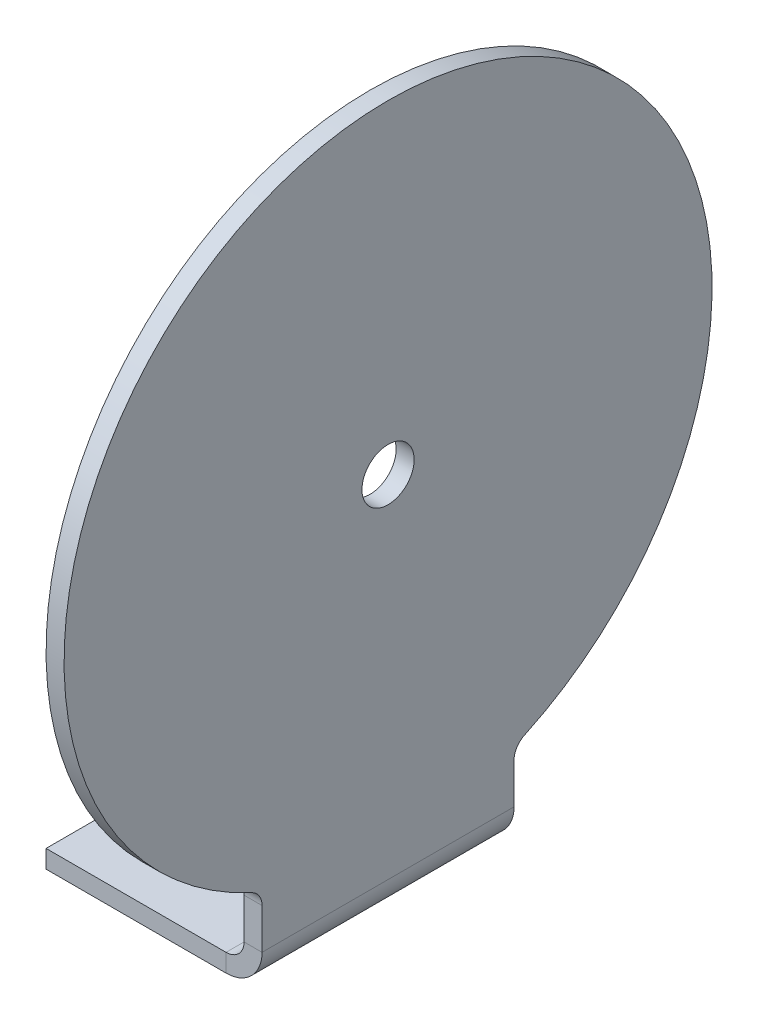
ISO-10303-21;
HEADER;
FILE_DESCRIPTION(('STEP AP214'),'2;1');
FILE_NAME('part.step','',(''),(''),'','','');
FILE_SCHEMA(('AUTOMOTIVE_DESIGN { 1 0 10303 214 1 1 1 1 }'));
ENDSEC;
DATA;
#1=APPLICATION_CONTEXT('core data for automotive mechanical design processes');
#2=APPLICATION_PROTOCOL_DEFINITION('international standard','automotive_design',2000,#1);
#3=PRODUCT_CONTEXT('',#1,'mechanical');
#4=PRODUCT('Part','Part','',(#3));
#5=PRODUCT_RELATED_PRODUCT_CATEGORY('part','',(#4));
#6=PRODUCT_DEFINITION_FORMATION('','',#4);
#7=PRODUCT_DEFINITION_CONTEXT('part definition',#1,'design');
#8=PRODUCT_DEFINITION('design','',#6,#7);
#9=PRODUCT_DEFINITION_SHAPE('','',#8);
#10=(LENGTH_UNIT() NAMED_UNIT(*) SI_UNIT(.MILLI.,.METRE.));
#11=(NAMED_UNIT(*) PLANE_ANGLE_UNIT() SI_UNIT($,.RADIAN.));
#12=(NAMED_UNIT(*) SI_UNIT($,.STERADIAN.) SOLID_ANGLE_UNIT());
#13=UNCERTAINTY_MEASURE_WITH_UNIT(LENGTH_MEASURE(1.E-05),#10,'distance_accuracy_value','');
#14=(GEOMETRIC_REPRESENTATION_CONTEXT(3) GLOBAL_UNCERTAINTY_ASSIGNED_CONTEXT((#13)) GLOBAL_UNIT_ASSIGNED_CONTEXT((#10,
#11,#12)) REPRESENTATION_CONTEXT('',''));
#15=CARTESIAN_POINT('',(0.,0.,0.));
#16=DIRECTION('',(0.,0.,1.));
#17=DIRECTION('',(1.,0.,0.));
#18=AXIS2_PLACEMENT_3D('',#15,#16,#17);
#19=CARTESIAN_POINT('',(-30.,-5.,-35.));
#20=DIRECTION('',(0.,0.,-1.));
#21=DIRECTION('',(-1.,0.,0.));
#22=AXIS2_PLACEMENT_3D('',#19,#20,#21);
#23=PLANE('',#22);
#24=DIRECTION('',(-1.,0.,0.));
#25=VECTOR('',#24,1.);
#26=CARTESIAN_POINT('',(-30.,0.,-35.));
#27=LINE('',#26,#25);
#28=CARTESIAN_POINT('',(20.,0.,-35.));
#29=VERTEX_POINT('',#28);
#30=CARTESIAN_POINT('',(-30.,0.,-35.));
#31=VERTEX_POINT('',#30);
#32=EDGE_CURVE('E201',#29,#31,#27,.T.);
#33=ORIENTED_EDGE('',*,*,#32,.F.);
#34=DIRECTION('',(0.,-1.,0.));
#35=VECTOR('',#34,1.);
#36=CARTESIAN_POINT('',(20.,0.,-35.));
#37=LINE('',#36,#35);
#38=CARTESIAN_POINT('',(20.,-5.00000000000001,-35.));
#39=VERTEX_POINT('',#38);
#40=EDGE_CURVE('E191',#29,#39,#37,.T.);
#41=ORIENTED_EDGE('',*,*,#40,.T.);
#42=DIRECTION('',(-1.,0.,0.));
#43=VECTOR('',#42,1.);
#44=CARTESIAN_POINT('',(-30.,-5.,-35.));
#45=LINE('',#44,#43);
#46=CARTESIAN_POINT('',(-30.,-5.,-35.));
#47=VERTEX_POINT('',#46);
#48=EDGE_CURVE('E203',#39,#47,#45,.T.);
#49=ORIENTED_EDGE('',*,*,#48,.T.);
#50=DIRECTION('',(0.,1.,0.));
#51=VECTOR('',#50,1.);
#52=CARTESIAN_POINT('',(-30.,-5.,-35.));
#53=LINE('',#52,#51);
#54=EDGE_CURVE('E214',#47,#31,#53,.T.);
#55=ORIENTED_EDGE('',*,*,#54,.T.);
#56=EDGE_LOOP('',(#33,#41,#49,#55));
#57=FACE_BOUND('',#56,.T.);
#58=ADVANCED_FACE('F64',(#57),#23,.T.);
#59=CARTESIAN_POINT('',(0.,-5.,0.));
#60=DIRECTION('',(0.,-1.,0.));
#61=DIRECTION('',(0.,0.,-1.));
#62=AXIS2_PLACEMENT_3D('',#59,#60,#61);
#63=PLANE('',#62);
#64=ORIENTED_EDGE('',*,*,#48,.F.);
#65=DIRECTION('',(0.,0.,-1.));
#66=VECTOR('',#65,1.);
#67=CARTESIAN_POINT('',(20.,-5.00000000000001,-35.));
#68=LINE('',#67,#66);
#69=CARTESIAN_POINT('',(20.,-5.,35.));
#70=VERTEX_POINT('',#69);
#71=EDGE_CURVE('E150',#39,#70,#68,.F.);
#72=ORIENTED_EDGE('',*,*,#71,.T.);
#73=DIRECTION('',(1.,0.,0.));
#74=VECTOR('',#73,1.);
#75=CARTESIAN_POINT('',(-30.,-5.,35.));
#76=LINE('',#75,#74);
#77=CARTESIAN_POINT('',(-30.,-5.,35.));
#78=VERTEX_POINT('',#77);
#79=EDGE_CURVE('E208',#78,#70,#76,.T.);
#80=ORIENTED_EDGE('',*,*,#79,.F.);
#81=DIRECTION('',(0.,0.,1.));
#82=VECTOR('',#81,1.);
#83=CARTESIAN_POINT('',(-30.,-5.,35.));
#84=LINE('',#83,#82);
#85=EDGE_CURVE('E207',#47,#78,#84,.T.);
#86=ORIENTED_EDGE('',*,*,#85,.F.);
#87=EDGE_LOOP('',(#64,#72,#80,#86));
#88=FACE_BOUND('',#87,.T.);
#89=ADVANCED_FACE('F258',(#88),#63,.T.);
#90=CARTESIAN_POINT('',(0.,0.,0.));
#91=DIRECTION('',(0.,-1.,0.));
#92=DIRECTION('',(0.,0.,-1.));
#93=AXIS2_PLACEMENT_3D('',#90,#91,#92);
#94=PLANE('',#93);
#95=DIRECTION('',(0.,0.,-1.));
#96=VECTOR('',#95,1.);
#97=CARTESIAN_POINT('',(20.,0.,-35.));
#98=LINE('',#97,#96);
#99=CARTESIAN_POINT('',(20.,0.,35.));
#100=VERTEX_POINT('',#99);
#101=EDGE_CURVE('E180',#29,#100,#98,.F.);
#102=ORIENTED_EDGE('',*,*,#101,.F.);
#103=ORIENTED_EDGE('',*,*,#32,.T.);
#104=DIRECTION('',(0.,0.,1.));
#105=VECTOR('',#104,1.);
#106=CARTESIAN_POINT('',(-30.,0.,35.));
#107=LINE('',#106,#105);
#108=CARTESIAN_POINT('',(-30.,0.,35.));
#109=VERTEX_POINT('',#108);
#110=EDGE_CURVE('E213',#31,#109,#107,.T.);
#111=ORIENTED_EDGE('',*,*,#110,.T.);
#112=DIRECTION('',(1.,0.,0.));
#113=VECTOR('',#112,1.);
#114=CARTESIAN_POINT('',(-30.,0.,35.));
#115=LINE('',#114,#113);
#116=EDGE_CURVE('E210',#109,#100,#115,.T.);
#117=ORIENTED_EDGE('',*,*,#116,.T.);
#118=EDGE_LOOP('',(#102,#103,#111,#117));
#119=FACE_BOUND('',#118,.T.);
#120=ADVANCED_FACE('F252',(#119),#94,.F.);
#121=CARTESIAN_POINT('',(-30.,-5.,35.));
#122=DIRECTION('',(0.,0.,1.));
#123=DIRECTION('',(1.,0.,0.));
#124=AXIS2_PLACEMENT_3D('',#121,#122,#123);
#125=PLANE('',#124);
#126=DIRECTION('',(0.,-1.,0.));
#127=VECTOR('',#126,1.);
#128=CARTESIAN_POINT('',(20.,0.,35.));
#129=LINE('',#128,#127);
#130=EDGE_CURVE('E198',#100,#70,#129,.T.);
#131=ORIENTED_EDGE('',*,*,#130,.F.);
#132=ORIENTED_EDGE('',*,*,#116,.F.);
#133=DIRECTION('',(0.,1.,0.));
#134=VECTOR('',#133,1.);
#135=CARTESIAN_POINT('',(-30.,-5.,35.));
#136=LINE('',#135,#134);
#137=EDGE_CURVE('E216',#78,#109,#136,.T.);
#138=ORIENTED_EDGE('',*,*,#137,.F.);
#139=ORIENTED_EDGE('',*,*,#79,.T.);
#140=EDGE_LOOP('',(#131,#132,#138,#139));
#141=FACE_BOUND('',#140,.T.);
#142=ADVANCED_FACE('F253',(#141),#125,.T.);
#143=CARTESIAN_POINT('',(-30.,-5.,35.));
#144=DIRECTION('',(-1.,0.,0.));
#145=DIRECTION('',(0.,0.,1.));
#146=AXIS2_PLACEMENT_3D('',#143,#144,#145);
#147=PLANE('',#146);
#148=ORIENTED_EDGE('',*,*,#110,.F.);
#149=ORIENTED_EDGE('',*,*,#54,.F.);
#150=ORIENTED_EDGE('',*,*,#85,.T.);
#151=ORIENTED_EDGE('',*,*,#137,.T.);
#152=EDGE_LOOP('',(#148,#149,#150,#151));
#153=FACE_BOUND('',#152,.T.);
#154=ADVANCED_FACE('F263',(#153),#147,.T.);
#155=CARTESIAN_POINT('',(20.,5.,35.));
#156=DIRECTION('',(0.,0.,1.));
#157=DIRECTION('',(0.,-1.,0.));
#158=AXIS2_PLACEMENT_3D('',#155,#156,#157);
#159=PLANE('',#158);
#160=DIRECTION('',(-1.,0.,0.));
#161=VECTOR('',#160,1.);
#162=CARTESIAN_POINT('',(30.,4.99999999999997,35.));
#163=LINE('',#162,#161);
#164=CARTESIAN_POINT('',(25.,4.99999999999999,35.));
#165=VERTEX_POINT('',#164);
#166=CARTESIAN_POINT('',(30.,4.99999999999997,35.));
#167=VERTEX_POINT('',#166);
#168=EDGE_CURVE('E189',#165,#167,#163,.F.);
#169=ORIENTED_EDGE('',*,*,#168,.F.);
#170=CARTESIAN_POINT('',(20.,5.,35.));
#171=DIRECTION('',(0.,0.,-1.));
#172=DIRECTION('',(0.,1.,0.));
#173=AXIS2_PLACEMENT_3D('',#170,#171,#172);
#174=CIRCLE('',#173,5.);
#175=EDGE_CURVE('E148',#100,#165,#174,.F.);
#176=ORIENTED_EDGE('',*,*,#175,.F.);
#177=ORIENTED_EDGE('',*,*,#130,.T.);
#178=CARTESIAN_POINT('',(20.,5.,35.));
#179=DIRECTION('',(0.,0.,-1.));
#180=DIRECTION('',(0.,1.,0.));
#181=AXIS2_PLACEMENT_3D('',#178,#179,#180);
#182=CIRCLE('',#181,10.);
#183=EDGE_CURVE('E194',#70,#167,#182,.F.);
#184=ORIENTED_EDGE('',*,*,#183,.T.);
#185=EDGE_LOOP('',(#169,#176,#177,#184));
#186=FACE_BOUND('',#185,.T.);
#187=ADVANCED_FACE('F250',(#186),#159,.T.);
#188=CARTESIAN_POINT('',(20.,5.,-35.));
#189=DIRECTION('',(0.,0.,1.));
#190=DIRECTION('',(0.,-1.,0.));
#191=AXIS2_PLACEMENT_3D('',#188,#189,#190);
#192=PLANE('',#191);
#193=CARTESIAN_POINT('',(20.,5.,-35.));
#194=DIRECTION('',(0.,0.,-1.));
#195=DIRECTION('',(0.,1.,0.));
#196=AXIS2_PLACEMENT_3D('',#193,#194,#195);
#197=CIRCLE('',#196,5.);
#198=CARTESIAN_POINT('',(25.,4.99999999999998,-35.));
#199=VERTEX_POINT('',#198);
#200=EDGE_CURVE('E160',#199,#29,#197,.T.);
#201=ORIENTED_EDGE('',*,*,#200,.F.);
#202=DIRECTION('',(-1.,0.,0.));
#203=VECTOR('',#202,1.);
#204=CARTESIAN_POINT('',(25.,4.99999999999998,-35.));
#205=LINE('',#204,#203);
#206=CARTESIAN_POINT('',(30.,4.99999999999996,-35.));
#207=VERTEX_POINT('',#206);
#208=EDGE_CURVE('E155',#199,#207,#205,.F.);
#209=ORIENTED_EDGE('',*,*,#208,.T.);
#210=CARTESIAN_POINT('',(20.,5.,-35.));
#211=DIRECTION('',(0.,0.,-1.));
#212=DIRECTION('',(0.,1.,0.));
#213=AXIS2_PLACEMENT_3D('',#210,#211,#212);
#214=CIRCLE('',#213,10.);
#215=EDGE_CURVE('E137',#207,#39,#214,.T.);
#216=ORIENTED_EDGE('',*,*,#215,.T.);
#217=ORIENTED_EDGE('',*,*,#40,.F.);
#218=EDGE_LOOP('',(#201,#209,#216,#217));
#219=FACE_BOUND('',#218,.T.);
#220=ADVANCED_FACE('F151',(#219),#192,.F.);
#221=CARTESIAN_POINT('',(20.,5.,-35.));
#222=DIRECTION('',(0.,0.,-1.));
#223=DIRECTION('',(1.,0.,0.));
#224=AXIS2_PLACEMENT_3D('',#221,#222,#223);
#225=CYLINDRICAL_SURFACE('',#224,10.);
#226=ORIENTED_EDGE('',*,*,#71,.F.);
#227=ORIENTED_EDGE('',*,*,#215,.F.);
#228=DIRECTION('',(0.,0.,-1.));
#229=VECTOR('',#228,1.);
#230=CARTESIAN_POINT('',(30.,4.99999999999997,35.));
#231=LINE('',#230,#229);
#232=EDGE_CURVE('E144',#207,#167,#231,.F.);
#233=ORIENTED_EDGE('',*,*,#232,.T.);
#234=ORIENTED_EDGE('',*,*,#183,.F.);
#235=EDGE_LOOP('',(#226,#227,#233,#234));
#236=FACE_BOUND('',#235,.T.);
#237=ADVANCED_FACE('F145',(#236),#225,.T.);
#238=CARTESIAN_POINT('',(20.,5.,-35.));
#239=DIRECTION('',(0.,0.,-1.));
#240=DIRECTION('',(1.,0.,0.));
#241=AXIS2_PLACEMENT_3D('',#238,#239,#240);
#242=CYLINDRICAL_SURFACE('',#241,5.);
#243=ORIENTED_EDGE('',*,*,#101,.T.);
#244=ORIENTED_EDGE('',*,*,#175,.T.);
#245=DIRECTION('',(0.,0.,-1.));
#246=VECTOR('',#245,1.);
#247=CARTESIAN_POINT('',(25.,4.99999999999998,35.));
#248=LINE('',#247,#246);
#249=EDGE_CURVE('E162',#165,#199,#248,.T.);
#250=ORIENTED_EDGE('',*,*,#249,.T.);
#251=ORIENTED_EDGE('',*,*,#200,.T.);
#252=EDGE_LOOP('',(#243,#244,#250,#251));
#253=FACE_BOUND('',#252,.T.);
#254=ADVANCED_FACE('F243',(#253),#242,.F.);
#255=CARTESIAN_POINT('',(30.,0.,35.));
#256=DIRECTION('',(0.,0.,-1.));
#257=DIRECTION('',(-1.,0.,0.));
#258=AXIS2_PLACEMENT_3D('',#255,#256,#257);
#259=PLANE('',#258);
#260=DIRECTION('',(0.,-1.,0.));
#261=VECTOR('',#260,1.);
#262=CARTESIAN_POINT('',(30.,-1.22751087445366E-13,35.));
#263=LINE('',#262,#261);
#264=CARTESIAN_POINT('',(30.,16.2565603019992,35.));
#265=VERTEX_POINT('',#264);
#266=EDGE_CURVE('E169',#265,#167,#263,.T.);
#267=ORIENTED_EDGE('',*,*,#266,.F.);
#268=DIRECTION('',(1.,0.,0.));
#269=VECTOR('',#268,1.);
#270=CARTESIAN_POINT('',(30.,16.2565603019992,35.));
#271=LINE('',#270,#269);
#272=CARTESIAN_POINT('',(25.0000000000001,16.2565603019992,35.));
#273=VERTEX_POINT('',#272);
#274=EDGE_CURVE('E233',#265,#273,#271,.F.);
#275=ORIENTED_EDGE('',*,*,#274,.T.);
#276=DIRECTION('',(0.,1.,0.));
#277=VECTOR('',#276,1.);
#278=CARTESIAN_POINT('',(25.,0.,35.));
#279=LINE('',#278,#277);
#280=EDGE_CURVE('E167',#273,#165,#279,.F.);
#281=ORIENTED_EDGE('',*,*,#280,.T.);
#282=ORIENTED_EDGE('',*,*,#168,.T.);
#283=EDGE_LOOP('',(#267,#275,#281,#282));
#284=FACE_BOUND('',#283,.T.);
#285=ADVANCED_FACE('F236',(#284),#259,.F.);
#286=CARTESIAN_POINT('',(30.0000000000003,86.,-35.));
#287=DIRECTION('',(0.,0.,1.));
#288=DIRECTION('',(1.,0.,0.));
#289=AXIS2_PLACEMENT_3D('',#286,#287,#288);
#290=PLANE('',#289);
#291=DIRECTION('',(0.,-1.,0.));
#292=VECTOR('',#291,1.);
#293=CARTESIAN_POINT('',(25.0000000000003,86.,-35.));
#294=LINE('',#293,#292);
#295=CARTESIAN_POINT('',(25.0000000000001,16.2565603019732,-35.));
#296=VERTEX_POINT('',#295);
#297=EDGE_CURVE('E177',#199,#296,#294,.F.);
#298=ORIENTED_EDGE('',*,*,#297,.T.);
#299=DIRECTION('',(1.,0.,0.));
#300=VECTOR('',#299,1.);
#301=CARTESIAN_POINT('',(30.0000000000001,16.2565603019732,-35.));
#302=LINE('',#301,#300);
#303=CARTESIAN_POINT('',(30.,16.2565603019732,-35.));
#304=VERTEX_POINT('',#303);
#305=EDGE_CURVE('E174',#296,#304,#302,.T.);
#306=ORIENTED_EDGE('',*,*,#305,.T.);
#307=DIRECTION('',(0.,1.,0.));
#308=VECTOR('',#307,1.);
#309=CARTESIAN_POINT('',(30.,-1.22751087445366E-13,-35.));
#310=LINE('',#309,#308);
#311=EDGE_CURVE('E170',#207,#304,#310,.T.);
#312=ORIENTED_EDGE('',*,*,#311,.F.);
#313=ORIENTED_EDGE('',*,*,#208,.F.);
#314=EDGE_LOOP('',(#298,#306,#312,#313));
#315=FACE_BOUND('',#314,.T.);
#316=ADVANCED_FACE('F173',(#315),#290,.F.);
#317=CARTESIAN_POINT('',(30.,-1.22751087445366E-13,0.));
#318=DIRECTION('',(-1.,0.,0.));
#319=DIRECTION('',(0.,-1.,0.));
#320=AXIS2_PLACEMENT_3D('',#317,#318,#319);
#321=PLANE('',#320);
#322=CARTESIAN_POINT('',(30.0000000000004,102.424999999962,-1.06371921483684E-11));
#323=DIRECTION('',(1.,0.,0.));
#324=DIRECTION('',(0.,1.,0.));
#325=AXIS2_PLACEMENT_3D('',#322,#323,#324);
#326=CIRCLE('',#325,7.25);
#327=CARTESIAN_POINT('',(30.0000000000004,109.674999999962,-1.06371921483684E-11));
#328=VERTEX_POINT('',#327);
#329=EDGE_CURVE('E294',#328,#328,#326,.T.);
#330=ORIENTED_EDGE('',*,*,#329,.F.);
#331=EDGE_LOOP('',(#330));
#332=FACE_BOUND('',#331,.T.);
#333=ORIENTED_EDGE('',*,*,#311,.T.);
#334=CARTESIAN_POINT('',(30.0000000000001,16.2565603019732,-40.));
#335=DIRECTION('',(-1.,0.,0.));
#336=DIRECTION('',(0.,-1.,0.));
#337=AXIS2_PLACEMENT_3D('',#334,#335,#336);
#338=CIRCLE('',#337,5.);
#339=CARTESIAN_POINT('',(30.0000000000001,20.7917413387144,-37.8947368421067));
#340=VERTEX_POINT('',#339);
#341=EDGE_CURVE('E227',#304,#340,#338,.T.);
#342=ORIENTED_EDGE('',*,*,#341,.T.);
#343=CARTESIAN_POINT('',(30.0000000000004,102.425000000057,-2.79776202205539E-11));
#344=DIRECTION('',(1.,0.,0.));
#345=DIRECTION('',(0.,1.,0.));
#346=AXIS2_PLACEMENT_3D('',#343,#344,#345);
#347=CIRCLE('',#346,90.);
#348=CARTESIAN_POINT('',(30.0000000000001,20.791741338739,37.8947368421038));
#349=VERTEX_POINT('',#348);
#350=EDGE_CURVE('E185',#340,#349,#347,.T.);
#351=ORIENTED_EDGE('',*,*,#350,.T.);
#352=CARTESIAN_POINT('',(30.0000000000001,16.2565603019992,40.));
#353=DIRECTION('',(-1.,0.,0.));
#354=DIRECTION('',(0.,-1.,0.));
#355=AXIS2_PLACEMENT_3D('',#352,#353,#354);
#356=CIRCLE('',#355,5.);
#357=EDGE_CURVE('E13',#349,#265,#356,.T.);
#358=ORIENTED_EDGE('',*,*,#357,.T.);
#359=ORIENTED_EDGE('',*,*,#266,.T.);
#360=ORIENTED_EDGE('',*,*,#232,.F.);
#361=EDGE_LOOP('',(#333,#342,#351,#358,#359,#360));
#362=FACE_BOUND('',#361,.T.);
#363=ADVANCED_FACE('F168',(#332,#362),#321,.F.);
#364=CARTESIAN_POINT('',(25.,-1.0529368075115E-13,0.));
#365=DIRECTION('',(-1.,0.,0.));
#366=DIRECTION('',(0.,-1.,0.));
#367=AXIS2_PLACEMENT_3D('',#364,#365,#366);
#368=PLANE('',#367);
#369=CARTESIAN_POINT('',(25.0000000000004,102.424999999962,-1.06371921483684E-11));
#370=DIRECTION('',(1.,0.,0.));
#371=DIRECTION('',(0.,1.,0.));
#372=AXIS2_PLACEMENT_3D('',#369,#370,#371);
#373=CIRCLE('',#372,7.25);
#374=CARTESIAN_POINT('',(25.0000000000004,109.674999999962,-1.06371921483684E-11));
#375=VERTEX_POINT('',#374);
#376=EDGE_CURVE('E291',#375,#375,#373,.T.);
#377=ORIENTED_EDGE('',*,*,#376,.T.);
#378=EDGE_LOOP('',(#377));
#379=FACE_BOUND('',#378,.T.);
#380=ORIENTED_EDGE('',*,*,#280,.F.);
#381=CARTESIAN_POINT('',(25.0000000000001,16.2565603019992,40.));
#382=DIRECTION('',(-1.,0.,0.));
#383=DIRECTION('',(0.,-1.,0.));
#384=AXIS2_PLACEMENT_3D('',#381,#382,#383);
#385=CIRCLE('',#384,5.);
#386=CARTESIAN_POINT('',(25.0000000000001,20.791741338739,37.8947368421038));
#387=VERTEX_POINT('',#386);
#388=EDGE_CURVE('E74',#273,#387,#385,.F.);
#389=ORIENTED_EDGE('',*,*,#388,.T.);
#390=CARTESIAN_POINT('',(25.0000000000004,102.425000000057,-2.79776202205539E-11));
#391=DIRECTION('',(1.,0.,0.));
#392=DIRECTION('',(0.,1.,0.));
#393=AXIS2_PLACEMENT_3D('',#390,#391,#392);
#394=CIRCLE('',#393,90.);
#395=CARTESIAN_POINT('',(25.0000000000001,20.7917413387144,-37.8947368421067));
#396=VERTEX_POINT('',#395);
#397=EDGE_CURVE('E192',#396,#387,#394,.T.);
#398=ORIENTED_EDGE('',*,*,#397,.F.);
#399=CARTESIAN_POINT('',(25.0000000000001,16.2565603019732,-40.));
#400=DIRECTION('',(-1.,0.,0.));
#401=DIRECTION('',(0.,-1.,0.));
#402=AXIS2_PLACEMENT_3D('',#399,#400,#401);
#403=CIRCLE('',#402,5.);
#404=EDGE_CURVE('E230',#396,#296,#403,.F.);
#405=ORIENTED_EDGE('',*,*,#404,.T.);
#406=ORIENTED_EDGE('',*,*,#297,.F.);
#407=ORIENTED_EDGE('',*,*,#249,.F.);
#408=EDGE_LOOP('',(#380,#389,#398,#405,#406,#407));
#409=FACE_BOUND('',#408,.T.);
#410=ADVANCED_FACE('F241',(#379,#409),#368,.T.);
#411=CARTESIAN_POINT('',(25.0000000000004,102.425000000057,-2.79776202205539E-11));
#412=DIRECTION('',(1.,0.,0.));
#413=DIRECTION('',(0.,1.,0.));
#414=AXIS2_PLACEMENT_3D('',#411,#412,#413);
#415=CYLINDRICAL_SURFACE('',#414,90.);
#416=ORIENTED_EDGE('',*,*,#397,.T.);
#417=DIRECTION('',(1.,0.,0.));
#418=VECTOR('',#417,1.);
#419=CARTESIAN_POINT('',(25.0000000000001,20.791741338739,37.8947368421038));
#420=LINE('',#419,#418);
#421=EDGE_CURVE('E81',#387,#349,#420,.T.);
#422=ORIENTED_EDGE('',*,*,#421,.T.);
#423=ORIENTED_EDGE('',*,*,#350,.F.);
#424=DIRECTION('',(1.,0.,0.));
#425=VECTOR('',#424,1.);
#426=CARTESIAN_POINT('',(25.0000000000001,20.7917413387144,-37.8947368421067));
#427=LINE('',#426,#425);
#428=EDGE_CURVE('E224',#340,#396,#427,.F.);
#429=ORIENTED_EDGE('',*,*,#428,.T.);
#430=EDGE_LOOP('',(#416,#422,#423,#429));
#431=FACE_BOUND('',#430,.T.);
#432=ADVANCED_FACE('F283',(#431),#415,.T.);
#433=CARTESIAN_POINT('',(25.0000000000001,16.2565603019732,-40.));
#434=DIRECTION('',(1.,0.,0.));
#435=DIRECTION('',(0.,1.,0.));
#436=AXIS2_PLACEMENT_3D('',#433,#434,#435);
#437=CYLINDRICAL_SURFACE('',#436,5.);
#438=ORIENTED_EDGE('',*,*,#404,.F.);
#439=ORIENTED_EDGE('',*,*,#428,.F.);
#440=ORIENTED_EDGE('',*,*,#341,.F.);
#441=ORIENTED_EDGE('',*,*,#305,.F.);
#442=EDGE_LOOP('',(#438,#439,#440,#441));
#443=FACE_BOUND('',#442,.T.);
#444=ADVANCED_FACE('F276',(#443),#437,.F.);
#445=CARTESIAN_POINT('',(25.0000000000001,16.2565603019992,40.));
#446=DIRECTION('',(1.,0.,0.));
#447=DIRECTION('',(0.,1.,0.));
#448=AXIS2_PLACEMENT_3D('',#445,#446,#447);
#449=CYLINDRICAL_SURFACE('',#448,5.);
#450=ORIENTED_EDGE('',*,*,#357,.F.);
#451=ORIENTED_EDGE('',*,*,#421,.F.);
#452=ORIENTED_EDGE('',*,*,#388,.F.);
#453=ORIENTED_EDGE('',*,*,#274,.F.);
#454=EDGE_LOOP('',(#450,#451,#452,#453));
#455=FACE_BOUND('',#454,.T.);
#456=ADVANCED_FACE('F63',(#455),#449,.F.);
#457=CARTESIAN_POINT('',(25.0000000000004,102.424999999962,-1.06371921483684E-11));
#458=DIRECTION('',(1.,0.,0.));
#459=DIRECTION('',(0.,1.,0.));
#460=AXIS2_PLACEMENT_3D('',#457,#458,#459);
#461=CYLINDRICAL_SURFACE('',#460,7.25);
#462=ORIENTED_EDGE('',*,*,#376,.F.);
#463=EDGE_LOOP('',(#462));
#464=FACE_BOUND('',#463,.T.);
#465=ORIENTED_EDGE('',*,*,#329,.T.);
#466=EDGE_LOOP('',(#465));
#467=FACE_BOUND('',#466,.T.);
#468=ADVANCED_FACE('F287',(#464,#467),#461,.F.);
#469=CLOSED_SHELL('',(#58,#89,#120,#142,#154,#187,#220,#237,#254,#285,#316,#363,#410,#432,#444,
#456,#468));
#470=MANIFOLD_SOLID_BREP('B2',#469);
#471=ADVANCED_BREP_SHAPE_REPRESENTATION('',(#18,#470),#14);
#472=SHAPE_DEFINITION_REPRESENTATION(#9,#471);
ENDSEC;
END-ISO-10303-21;
